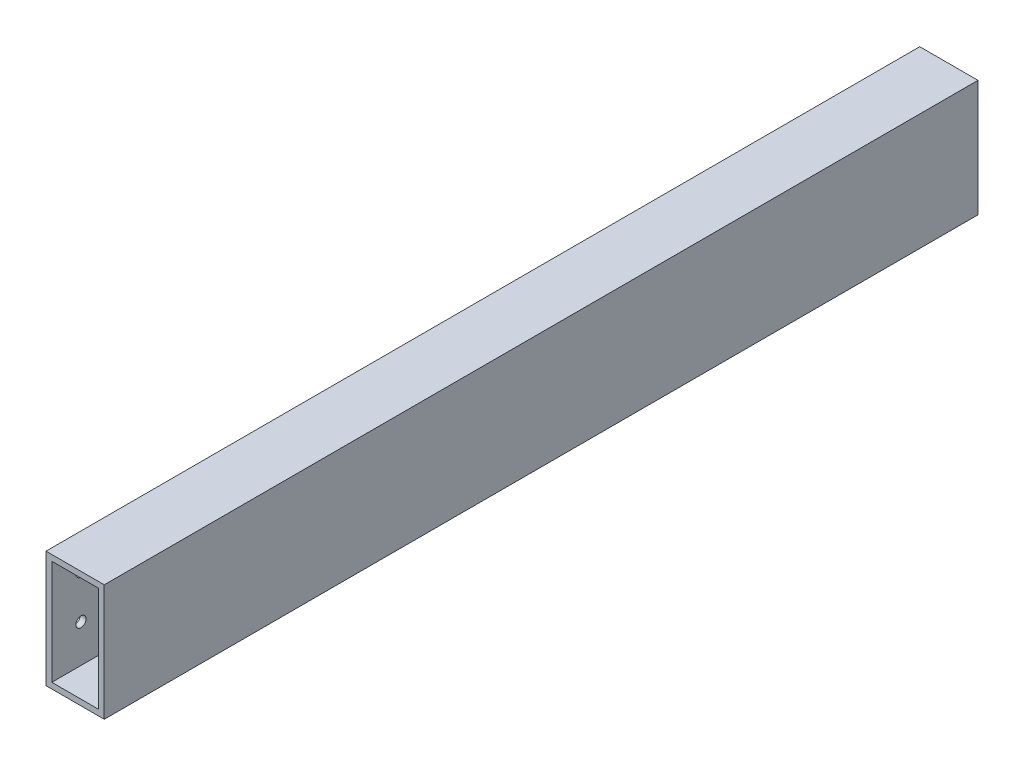
ISO-10303-21;
HEADER;
FILE_DESCRIPTION(('STEP AP214'),'2;1');
FILE_NAME('part.step','',(''),(''),'','','');
FILE_SCHEMA(('AUTOMOTIVE_DESIGN { 1 0 10303 214 1 1 1 1 }'));
ENDSEC;
DATA;
#1=APPLICATION_CONTEXT('core data for automotive mechanical design processes');
#2=APPLICATION_PROTOCOL_DEFINITION('international standard','automotive_design',2000,#1);
#3=PRODUCT_CONTEXT('',#1,'mechanical');
#4=PRODUCT('Part','Part','',(#3));
#5=PRODUCT_RELATED_PRODUCT_CATEGORY('part','',(#4));
#6=PRODUCT_DEFINITION_FORMATION('','',#4);
#7=PRODUCT_DEFINITION_CONTEXT('part definition',#1,'design');
#8=PRODUCT_DEFINITION('design','',#6,#7);
#9=PRODUCT_DEFINITION_SHAPE('','',#8);
#10=(LENGTH_UNIT() NAMED_UNIT(*) SI_UNIT(.MILLI.,.METRE.));
#11=(NAMED_UNIT(*) PLANE_ANGLE_UNIT() SI_UNIT($,.RADIAN.));
#12=(NAMED_UNIT(*) SI_UNIT($,.STERADIAN.) SOLID_ANGLE_UNIT());
#13=UNCERTAINTY_MEASURE_WITH_UNIT(LENGTH_MEASURE(1.E-05),#10,'distance_accuracy_value','');
#14=(GEOMETRIC_REPRESENTATION_CONTEXT(3) GLOBAL_UNCERTAINTY_ASSIGNED_CONTEXT((#13)) GLOBAL_UNIT_ASSIGNED_CONTEXT((#10,
#11,#12)) REPRESENTATION_CONTEXT('',''));
#15=CARTESIAN_POINT('',(0.,0.,0.));
#16=DIRECTION('',(0.,0.,1.));
#17=DIRECTION('',(1.,0.,0.));
#18=AXIS2_PLACEMENT_3D('',#15,#16,#17);
#19=CARTESIAN_POINT('',(0.,0.,300.));
#20=DIRECTION('',(0.,0.,-1.));
#21=DIRECTION('',(-1.,0.,0.));
#22=AXIS2_PLACEMENT_3D('',#19,#20,#21);
#23=PLANE('',#22);
#24=DIRECTION('',(0.,-1.,0.));
#25=VECTOR('',#24,1.);
#26=CARTESIAN_POINT('',(0.,0.,300.));
#27=LINE('',#26,#25);
#28=CARTESIAN_POINT('',(0.,40.,300.));
#29=VERTEX_POINT('',#28);
#30=CARTESIAN_POINT('',(0.,0.,300.));
#31=VERTEX_POINT('',#30);
#32=EDGE_CURVE('E136',#29,#31,#27,.T.);
#33=ORIENTED_EDGE('',*,*,#32,.T.);
#34=DIRECTION('',(1.,0.,0.));
#35=VECTOR('',#34,1.);
#36=CARTESIAN_POINT('',(0.,0.,300.));
#37=LINE('',#36,#35);
#38=CARTESIAN_POINT('',(20.,0.,300.));
#39=VERTEX_POINT('',#38);
#40=EDGE_CURVE('E139',#31,#39,#37,.T.);
#41=ORIENTED_EDGE('',*,*,#40,.T.);
#42=DIRECTION('',(0.,1.,0.));
#43=VECTOR('',#42,1.);
#44=CARTESIAN_POINT('',(20.,0.,300.));
#45=LINE('',#44,#43);
#46=CARTESIAN_POINT('',(20.,40.,300.));
#47=VERTEX_POINT('',#46);
#48=EDGE_CURVE('E142',#39,#47,#45,.T.);
#49=ORIENTED_EDGE('',*,*,#48,.T.);
#50=DIRECTION('',(-1.,0.,0.));
#51=VECTOR('',#50,1.);
#52=CARTESIAN_POINT('',(0.,40.,300.));
#53=LINE('',#52,#51);
#54=EDGE_CURVE('E144',#47,#29,#53,.T.);
#55=ORIENTED_EDGE('',*,*,#54,.T.);
#56=EDGE_LOOP('',(#33,#41,#49,#55));
#57=FACE_BOUND('',#56,.T.);
#58=DIRECTION('',(0.,-1.,0.));
#59=VECTOR('',#58,1.);
#60=CARTESIAN_POINT('',(2.,2.,300.));
#61=LINE('',#60,#59);
#62=CARTESIAN_POINT('',(2.,38.,300.));
#63=VERTEX_POINT('',#62);
#64=CARTESIAN_POINT('',(2.,2.,300.));
#65=VERTEX_POINT('',#64);
#66=EDGE_CURVE('E98',#63,#65,#61,.T.);
#67=ORIENTED_EDGE('',*,*,#66,.F.);
#68=DIRECTION('',(-1.,0.,0.));
#69=VECTOR('',#68,1.);
#70=CARTESIAN_POINT('',(2.,38.,300.));
#71=LINE('',#70,#69);
#72=CARTESIAN_POINT('',(18.,38.,300.));
#73=VERTEX_POINT('',#72);
#74=EDGE_CURVE('E120',#73,#63,#71,.T.);
#75=ORIENTED_EDGE('',*,*,#74,.F.);
#76=DIRECTION('',(0.,1.,0.));
#77=VECTOR('',#76,1.);
#78=CARTESIAN_POINT('',(18.,2.,300.));
#79=LINE('',#78,#77);
#80=CARTESIAN_POINT('',(18.,2.,300.));
#81=VERTEX_POINT('',#80);
#82=EDGE_CURVE('E118',#81,#73,#79,.T.);
#83=ORIENTED_EDGE('',*,*,#82,.F.);
#84=DIRECTION('',(1.,0.,0.));
#85=VECTOR('',#84,1.);
#86=CARTESIAN_POINT('',(2.,2.,300.));
#87=LINE('',#86,#85);
#88=EDGE_CURVE('E106',#65,#81,#87,.T.);
#89=ORIENTED_EDGE('',*,*,#88,.F.);
#90=EDGE_LOOP('',(#67,#75,#83,#89));
#91=FACE_BOUND('',#90,.T.);
#92=ADVANCED_FACE('F33',(#57,#91),#23,.F.);
#93=CARTESIAN_POINT('',(0.,0.,0.));
#94=DIRECTION('',(0.,0.,-1.));
#95=DIRECTION('',(-1.,0.,0.));
#96=AXIS2_PLACEMENT_3D('',#93,#94,#95);
#97=PLANE('',#96);
#98=DIRECTION('',(0.,-1.,0.));
#99=VECTOR('',#98,1.);
#100=CARTESIAN_POINT('',(0.,0.,0.));
#101=LINE('',#100,#99);
#102=CARTESIAN_POINT('',(0.,40.,0.));
#103=VERTEX_POINT('',#102);
#104=CARTESIAN_POINT('',(0.,0.,0.));
#105=VERTEX_POINT('',#104);
#106=EDGE_CURVE('E114',#103,#105,#101,.T.);
#107=ORIENTED_EDGE('',*,*,#106,.F.);
#108=DIRECTION('',(-1.,0.,0.));
#109=VECTOR('',#108,1.);
#110=CARTESIAN_POINT('',(0.,40.,0.));
#111=LINE('',#110,#109);
#112=CARTESIAN_POINT('',(20.,40.,0.));
#113=VERTEX_POINT('',#112);
#114=EDGE_CURVE('E140',#113,#103,#111,.T.);
#115=ORIENTED_EDGE('',*,*,#114,.F.);
#116=DIRECTION('',(0.,1.,0.));
#117=VECTOR('',#116,1.);
#118=CARTESIAN_POINT('',(20.,0.,0.));
#119=LINE('',#118,#117);
#120=CARTESIAN_POINT('',(20.,0.,0.));
#121=VERTEX_POINT('',#120);
#122=EDGE_CURVE('E151',#121,#113,#119,.T.);
#123=ORIENTED_EDGE('',*,*,#122,.F.);
#124=DIRECTION('',(1.,0.,0.));
#125=VECTOR('',#124,1.);
#126=CARTESIAN_POINT('',(0.,0.,0.));
#127=LINE('',#126,#125);
#128=EDGE_CURVE('E149',#105,#121,#127,.T.);
#129=ORIENTED_EDGE('',*,*,#128,.F.);
#130=EDGE_LOOP('',(#107,#115,#123,#129));
#131=FACE_BOUND('',#130,.T.);
#132=DIRECTION('',(-1.,0.,0.));
#133=VECTOR('',#132,1.);
#134=CARTESIAN_POINT('',(2.,38.,0.));
#135=LINE('',#134,#133);
#136=CARTESIAN_POINT('',(18.,38.,0.));
#137=VERTEX_POINT('',#136);
#138=CARTESIAN_POINT('',(2.,38.,0.));
#139=VERTEX_POINT('',#138);
#140=EDGE_CURVE('E107',#137,#139,#135,.T.);
#141=ORIENTED_EDGE('',*,*,#140,.T.);
#142=DIRECTION('',(0.,-1.,0.));
#143=VECTOR('',#142,1.);
#144=CARTESIAN_POINT('',(2.,2.,0.));
#145=LINE('',#144,#143);
#146=CARTESIAN_POINT('',(2.,2.,0.));
#147=VERTEX_POINT('',#146);
#148=EDGE_CURVE('E56',#139,#147,#145,.T.);
#149=ORIENTED_EDGE('',*,*,#148,.T.);
#150=DIRECTION('',(1.,0.,0.));
#151=VECTOR('',#150,1.);
#152=CARTESIAN_POINT('',(2.,2.,0.));
#153=LINE('',#152,#151);
#154=CARTESIAN_POINT('',(18.,2.,0.));
#155=VERTEX_POINT('',#154);
#156=EDGE_CURVE('E113',#147,#155,#153,.T.);
#157=ORIENTED_EDGE('',*,*,#156,.T.);
#158=DIRECTION('',(0.,1.,0.));
#159=VECTOR('',#158,1.);
#160=CARTESIAN_POINT('',(18.,2.,0.));
#161=LINE('',#160,#159);
#162=EDGE_CURVE('E128',#155,#137,#161,.T.);
#163=ORIENTED_EDGE('',*,*,#162,.T.);
#164=EDGE_LOOP('',(#141,#149,#157,#163));
#165=FACE_BOUND('',#164,.T.);
#166=ADVANCED_FACE('F169',(#131,#165),#97,.T.);
#167=CARTESIAN_POINT('',(0.,0.,300.));
#168=DIRECTION('',(1.,0.,0.));
#169=DIRECTION('',(0.,0.,-1.));
#170=AXIS2_PLACEMENT_3D('',#167,#168,#169);
#171=PLANE('',#170);
#172=CARTESIAN_POINT('',(0.,30.,290.));
#173=DIRECTION('',(-1.,0.,0.));
#174=DIRECTION('',(0.,0.,-1.));
#175=AXIS2_PLACEMENT_3D('',#172,#173,#174);
#176=CIRCLE('',#175,1.74999999999998);
#177=CARTESIAN_POINT('',(0.,30.,288.25));
#178=VERTEX_POINT('',#177);
#179=EDGE_CURVE('E240',#178,#178,#176,.T.);
#180=ORIENTED_EDGE('',*,*,#179,.F.);
#181=EDGE_LOOP('',(#180));
#182=FACE_BOUND('',#181,.T.);
#183=CARTESIAN_POINT('',(0.,15.,290.));
#184=DIRECTION('',(-1.,0.,0.));
#185=DIRECTION('',(0.,0.,-1.));
#186=AXIS2_PLACEMENT_3D('',#183,#184,#185);
#187=CIRCLE('',#186,1.74999999999998);
#188=CARTESIAN_POINT('',(0.,15.,288.25));
#189=VERTEX_POINT('',#188);
#190=EDGE_CURVE('E244',#189,#189,#187,.T.);
#191=ORIENTED_EDGE('',*,*,#190,.F.);
#192=EDGE_LOOP('',(#191));
#193=FACE_BOUND('',#192,.T.);
#194=CARTESIAN_POINT('',(0.,15.,245.));
#195=DIRECTION('',(-1.,0.,0.));
#196=DIRECTION('',(0.,0.,-1.));
#197=AXIS2_PLACEMENT_3D('',#194,#195,#196);
#198=CIRCLE('',#197,1.74999999999998);
#199=CARTESIAN_POINT('',(0.,15.,243.25));
#200=VERTEX_POINT('',#199);
#201=EDGE_CURVE('E248',#200,#200,#198,.T.);
#202=ORIENTED_EDGE('',*,*,#201,.F.);
#203=EDGE_LOOP('',(#202));
#204=FACE_BOUND('',#203,.T.);
#205=CARTESIAN_POINT('',(0.,15.,10.));
#206=DIRECTION('',(-1.,0.,0.));
#207=DIRECTION('',(0.,0.,1.));
#208=AXIS2_PLACEMENT_3D('',#205,#206,#207);
#209=CIRCLE('',#208,1.75);
#210=CARTESIAN_POINT('',(0.,15.,11.75));
#211=VERTEX_POINT('',#210);
#212=EDGE_CURVE('E257',#211,#211,#209,.T.);
#213=ORIENTED_EDGE('',*,*,#212,.F.);
#214=EDGE_LOOP('',(#213));
#215=FACE_BOUND('',#214,.T.);
#216=CARTESIAN_POINT('',(0.,15.,70.));
#217=DIRECTION('',(-1.,0.,0.));
#218=DIRECTION('',(0.,0.,1.));
#219=AXIS2_PLACEMENT_3D('',#216,#217,#218);
#220=CIRCLE('',#219,1.75);
#221=CARTESIAN_POINT('',(0.,15.,71.75));
#222=VERTEX_POINT('',#221);
#223=EDGE_CURVE('E253',#222,#222,#220,.T.);
#224=ORIENTED_EDGE('',*,*,#223,.F.);
#225=EDGE_LOOP('',(#224));
#226=FACE_BOUND('',#225,.T.);
#227=CARTESIAN_POINT('',(0.,15.,55.));
#228=DIRECTION('',(-1.,0.,0.));
#229=DIRECTION('',(0.,0.,1.));
#230=AXIS2_PLACEMENT_3D('',#227,#228,#229);
#231=CIRCLE('',#230,1.75);
#232=CARTESIAN_POINT('',(0.,15.,56.75));
#233=VERTEX_POINT('',#232);
#234=EDGE_CURVE('E264',#233,#233,#231,.T.);
#235=ORIENTED_EDGE('',*,*,#234,.F.);
#236=EDGE_LOOP('',(#235));
#237=FACE_BOUND('',#236,.T.);
#238=CARTESIAN_POINT('',(0.,15.,230.));
#239=DIRECTION('',(-1.,0.,0.));
#240=DIRECTION('',(0.,0.,-1.));
#241=AXIS2_PLACEMENT_3D('',#238,#239,#240);
#242=CIRCLE('',#241,1.74999999999998);
#243=CARTESIAN_POINT('',(0.,15.,228.25));
#244=VERTEX_POINT('',#243);
#245=EDGE_CURVE('E252',#244,#244,#242,.T.);
#246=ORIENTED_EDGE('',*,*,#245,.F.);
#247=EDGE_LOOP('',(#246));
#248=FACE_BOUND('',#247,.T.);
#249=CARTESIAN_POINT('',(0.,30.,10.));
#250=DIRECTION('',(-1.,0.,0.));
#251=DIRECTION('',(0.,0.,1.));
#252=AXIS2_PLACEMENT_3D('',#249,#250,#251);
#253=CIRCLE('',#252,1.75);
#254=CARTESIAN_POINT('',(0.,30.,11.75));
#255=VERTEX_POINT('',#254);
#256=EDGE_CURVE('E236',#255,#255,#253,.T.);
#257=ORIENTED_EDGE('',*,*,#256,.F.);
#258=EDGE_LOOP('',(#257));
#259=FACE_BOUND('',#258,.T.);
#260=ORIENTED_EDGE('',*,*,#106,.T.);
#261=DIRECTION('',(0.,0.,-1.));
#262=VECTOR('',#261,1.);
#263=CARTESIAN_POINT('',(0.,0.,300.));
#264=LINE('',#263,#262);
#265=EDGE_CURVE('E11',#31,#105,#264,.T.);
#266=ORIENTED_EDGE('',*,*,#265,.F.);
#267=ORIENTED_EDGE('',*,*,#32,.F.);
#268=DIRECTION('',(0.,0.,-1.));
#269=VECTOR('',#268,1.);
#270=CARTESIAN_POINT('',(0.,40.,300.));
#271=LINE('',#270,#269);
#272=EDGE_CURVE('E146',#29,#103,#271,.T.);
#273=ORIENTED_EDGE('',*,*,#272,.T.);
#274=EDGE_LOOP('',(#260,#266,#267,#273));
#275=FACE_BOUND('',#274,.T.);
#276=ADVANCED_FACE('F35',(#182,#193,#204,#215,#226,#237,#248,#259,#275),#171,.F.);
#277=CARTESIAN_POINT('',(0.,0.,300.));
#278=DIRECTION('',(0.,1.,0.));
#279=DIRECTION('',(0.,0.,1.));
#280=AXIS2_PLACEMENT_3D('',#277,#278,#279);
#281=PLANE('',#280);
#282=ORIENTED_EDGE('',*,*,#128,.T.);
#283=DIRECTION('',(0.,0.,-1.));
#284=VECTOR('',#283,1.);
#285=CARTESIAN_POINT('',(20.,0.,300.));
#286=LINE('',#285,#284);
#287=EDGE_CURVE('E41',#39,#121,#286,.T.);
#288=ORIENTED_EDGE('',*,*,#287,.F.);
#289=ORIENTED_EDGE('',*,*,#40,.F.);
#290=ORIENTED_EDGE('',*,*,#265,.T.);
#291=EDGE_LOOP('',(#282,#288,#289,#290));
#292=FACE_BOUND('',#291,.T.);
#293=ADVANCED_FACE('F179',(#292),#281,.F.);
#294=CARTESIAN_POINT('',(20.,0.,300.));
#295=DIRECTION('',(-1.,0.,0.));
#296=DIRECTION('',(0.,0.,1.));
#297=AXIS2_PLACEMENT_3D('',#294,#295,#296);
#298=PLANE('',#297);
#299=ORIENTED_EDGE('',*,*,#122,.T.);
#300=DIRECTION('',(0.,0.,-1.));
#301=VECTOR('',#300,1.);
#302=CARTESIAN_POINT('',(20.,40.,300.));
#303=LINE('',#302,#301);
#304=EDGE_CURVE('E156',#47,#113,#303,.T.);
#305=ORIENTED_EDGE('',*,*,#304,.F.);
#306=ORIENTED_EDGE('',*,*,#48,.F.);
#307=ORIENTED_EDGE('',*,*,#287,.T.);
#308=EDGE_LOOP('',(#299,#305,#306,#307));
#309=FACE_BOUND('',#308,.T.);
#310=ADVANCED_FACE('F163',(#309),#298,.F.);
#311=CARTESIAN_POINT('',(0.,40.,300.));
#312=DIRECTION('',(0.,-1.,0.));
#313=DIRECTION('',(0.,0.,-1.));
#314=AXIS2_PLACEMENT_3D('',#311,#312,#313);
#315=PLANE('',#314);
#316=ORIENTED_EDGE('',*,*,#114,.T.);
#317=ORIENTED_EDGE('',*,*,#272,.F.);
#318=ORIENTED_EDGE('',*,*,#54,.F.);
#319=ORIENTED_EDGE('',*,*,#304,.T.);
#320=EDGE_LOOP('',(#316,#317,#318,#319));
#321=FACE_BOUND('',#320,.T.);
#322=ADVANCED_FACE('F173',(#321),#315,.F.);
#323=CARTESIAN_POINT('',(2.,2.,300.));
#324=DIRECTION('',(1.,0.,0.));
#325=DIRECTION('',(0.,0.,-1.));
#326=AXIS2_PLACEMENT_3D('',#323,#324,#325);
#327=PLANE('',#326);
#328=CARTESIAN_POINT('',(2.,30.,290.));
#329=DIRECTION('',(-1.,0.,0.));
#330=DIRECTION('',(0.,0.,-1.));
#331=AXIS2_PLACEMENT_3D('',#328,#329,#330);
#332=CIRCLE('',#331,1.74999999999998);
#333=CARTESIAN_POINT('',(2.,30.,288.25));
#334=VERTEX_POINT('',#333);
#335=EDGE_CURVE('E208',#334,#334,#332,.T.);
#336=ORIENTED_EDGE('',*,*,#335,.T.);
#337=EDGE_LOOP('',(#336));
#338=FACE_BOUND('',#337,.T.);
#339=CARTESIAN_POINT('',(2.,15.,290.));
#340=DIRECTION('',(-1.,0.,0.));
#341=DIRECTION('',(0.,0.,-1.));
#342=AXIS2_PLACEMENT_3D('',#339,#340,#341);
#343=CIRCLE('',#342,1.74999999999998);
#344=CARTESIAN_POINT('',(2.,15.,288.25));
#345=VERTEX_POINT('',#344);
#346=EDGE_CURVE('E212',#345,#345,#343,.T.);
#347=ORIENTED_EDGE('',*,*,#346,.T.);
#348=EDGE_LOOP('',(#347));
#349=FACE_BOUND('',#348,.T.);
#350=CARTESIAN_POINT('',(2.,15.,245.));
#351=DIRECTION('',(-1.,0.,0.));
#352=DIRECTION('',(0.,0.,-1.));
#353=AXIS2_PLACEMENT_3D('',#350,#351,#352);
#354=CIRCLE('',#353,1.74999999999998);
#355=CARTESIAN_POINT('',(2.,15.,243.25));
#356=VERTEX_POINT('',#355);
#357=EDGE_CURVE('E216',#356,#356,#354,.T.);
#358=ORIENTED_EDGE('',*,*,#357,.T.);
#359=EDGE_LOOP('',(#358));
#360=FACE_BOUND('',#359,.T.);
#361=CARTESIAN_POINT('',(2.,15.,10.));
#362=DIRECTION('',(-1.,0.,0.));
#363=DIRECTION('',(0.,0.,1.));
#364=AXIS2_PLACEMENT_3D('',#361,#362,#363);
#365=CIRCLE('',#364,1.75);
#366=CARTESIAN_POINT('',(2.,15.,11.75));
#367=VERTEX_POINT('',#366);
#368=EDGE_CURVE('E220',#367,#367,#365,.T.);
#369=ORIENTED_EDGE('',*,*,#368,.T.);
#370=EDGE_LOOP('',(#369));
#371=FACE_BOUND('',#370,.T.);
#372=CARTESIAN_POINT('',(2.,15.,70.));
#373=DIRECTION('',(-1.,0.,0.));
#374=DIRECTION('',(0.,0.,1.));
#375=AXIS2_PLACEMENT_3D('',#372,#373,#374);
#376=CIRCLE('',#375,1.75);
#377=CARTESIAN_POINT('',(2.,15.,71.75));
#378=VERTEX_POINT('',#377);
#379=EDGE_CURVE('E224',#378,#378,#376,.T.);
#380=ORIENTED_EDGE('',*,*,#379,.T.);
#381=EDGE_LOOP('',(#380));
#382=FACE_BOUND('',#381,.T.);
#383=CARTESIAN_POINT('',(2.,15.,55.));
#384=DIRECTION('',(-1.,0.,0.));
#385=DIRECTION('',(0.,0.,1.));
#386=AXIS2_PLACEMENT_3D('',#383,#384,#385);
#387=CIRCLE('',#386,1.75);
#388=CARTESIAN_POINT('',(2.,15.,56.75));
#389=VERTEX_POINT('',#388);
#390=EDGE_CURVE('E228',#389,#389,#387,.T.);
#391=ORIENTED_EDGE('',*,*,#390,.T.);
#392=EDGE_LOOP('',(#391));
#393=FACE_BOUND('',#392,.T.);
#394=CARTESIAN_POINT('',(2.,15.,230.));
#395=DIRECTION('',(-1.,0.,0.));
#396=DIRECTION('',(0.,0.,-1.));
#397=AXIS2_PLACEMENT_3D('',#394,#395,#396);
#398=CIRCLE('',#397,1.74999999999998);
#399=CARTESIAN_POINT('',(2.,15.,228.25));
#400=VERTEX_POINT('',#399);
#401=EDGE_CURVE('E232',#400,#400,#398,.T.);
#402=ORIENTED_EDGE('',*,*,#401,.T.);
#403=EDGE_LOOP('',(#402));
#404=FACE_BOUND('',#403,.T.);
#405=CARTESIAN_POINT('',(2.,30.,10.));
#406=DIRECTION('',(-1.,0.,0.));
#407=DIRECTION('',(0.,0.,1.));
#408=AXIS2_PLACEMENT_3D('',#405,#406,#407);
#409=CIRCLE('',#408,1.75);
#410=CARTESIAN_POINT('',(2.,30.,11.75));
#411=VERTEX_POINT('',#410);
#412=EDGE_CURVE('E126',#411,#411,#409,.T.);
#413=ORIENTED_EDGE('',*,*,#412,.T.);
#414=EDGE_LOOP('',(#413));
#415=FACE_BOUND('',#414,.T.);
#416=ORIENTED_EDGE('',*,*,#148,.F.);
#417=DIRECTION('',(0.,0.,-1.));
#418=VECTOR('',#417,1.);
#419=CARTESIAN_POINT('',(2.,38.,300.));
#420=LINE('',#419,#418);
#421=EDGE_CURVE('E102',#63,#139,#420,.T.);
#422=ORIENTED_EDGE('',*,*,#421,.F.);
#423=ORIENTED_EDGE('',*,*,#66,.T.);
#424=DIRECTION('',(0.,0.,-1.));
#425=VECTOR('',#424,1.);
#426=CARTESIAN_POINT('',(2.,2.,300.));
#427=LINE('',#426,#425);
#428=EDGE_CURVE('E101',#65,#147,#427,.T.);
#429=ORIENTED_EDGE('',*,*,#428,.T.);
#430=EDGE_LOOP('',(#416,#422,#423,#429));
#431=FACE_BOUND('',#430,.T.);
#432=ADVANCED_FACE('F100',(#338,#349,#360,#371,#382,#393,#404,#415,#431),#327,.T.);
#433=CARTESIAN_POINT('',(2.,2.,300.));
#434=DIRECTION('',(0.,1.,0.));
#435=DIRECTION('',(0.,0.,1.));
#436=AXIS2_PLACEMENT_3D('',#433,#434,#435);
#437=PLANE('',#436);
#438=ORIENTED_EDGE('',*,*,#156,.F.);
#439=ORIENTED_EDGE('',*,*,#428,.F.);
#440=ORIENTED_EDGE('',*,*,#88,.T.);
#441=DIRECTION('',(0.,0.,-1.));
#442=VECTOR('',#441,1.);
#443=CARTESIAN_POINT('',(18.,2.,300.));
#444=LINE('',#443,#442);
#445=EDGE_CURVE('E115',#81,#155,#444,.T.);
#446=ORIENTED_EDGE('',*,*,#445,.T.);
#447=EDGE_LOOP('',(#438,#439,#440,#446));
#448=FACE_BOUND('',#447,.T.);
#449=ADVANCED_FACE('F110',(#448),#437,.T.);
#450=CARTESIAN_POINT('',(18.,2.,300.));
#451=DIRECTION('',(-1.,0.,0.));
#452=DIRECTION('',(0.,0.,1.));
#453=AXIS2_PLACEMENT_3D('',#450,#451,#452);
#454=PLANE('',#453);
#455=ORIENTED_EDGE('',*,*,#162,.F.);
#456=ORIENTED_EDGE('',*,*,#445,.F.);
#457=ORIENTED_EDGE('',*,*,#82,.T.);
#458=DIRECTION('',(0.,0.,-1.));
#459=VECTOR('',#458,1.);
#460=CARTESIAN_POINT('',(18.,38.,300.));
#461=LINE('',#460,#459);
#462=EDGE_CURVE('E48',#73,#137,#461,.T.);
#463=ORIENTED_EDGE('',*,*,#462,.T.);
#464=EDGE_LOOP('',(#455,#456,#457,#463));
#465=FACE_BOUND('',#464,.T.);
#466=ADVANCED_FACE('F204',(#465),#454,.T.);
#467=CARTESIAN_POINT('',(2.,38.,300.));
#468=DIRECTION('',(0.,-1.,0.));
#469=DIRECTION('',(0.,0.,-1.));
#470=AXIS2_PLACEMENT_3D('',#467,#468,#469);
#471=PLANE('',#470);
#472=ORIENTED_EDGE('',*,*,#140,.F.);
#473=ORIENTED_EDGE('',*,*,#462,.F.);
#474=ORIENTED_EDGE('',*,*,#74,.T.);
#475=ORIENTED_EDGE('',*,*,#421,.T.);
#476=EDGE_LOOP('',(#472,#473,#474,#475));
#477=FACE_BOUND('',#476,.T.);
#478=ADVANCED_FACE('F279',(#477),#471,.T.);
#479=CARTESIAN_POINT('',(2.,30.,10.));
#480=DIRECTION('',(-1.,0.,0.));
#481=DIRECTION('',(0.,0.,1.));
#482=AXIS2_PLACEMENT_3D('',#479,#480,#481);
#483=CYLINDRICAL_SURFACE('',#482,1.75);
#484=ORIENTED_EDGE('',*,*,#412,.F.);
#485=EDGE_LOOP('',(#484));
#486=FACE_BOUND('',#485,.T.);
#487=ORIENTED_EDGE('',*,*,#256,.T.);
#488=EDGE_LOOP('',(#487));
#489=FACE_BOUND('',#488,.T.);
#490=ADVANCED_FACE('F276',(#486,#489),#483,.F.);
#491=CARTESIAN_POINT('',(2.,15.,230.));
#492=DIRECTION('',(-1.,0.,0.));
#493=DIRECTION('',(0.,0.,1.));
#494=AXIS2_PLACEMENT_3D('',#491,#492,#493);
#495=CYLINDRICAL_SURFACE('',#494,1.74999999999998);
#496=ORIENTED_EDGE('',*,*,#401,.F.);
#497=EDGE_LOOP('',(#496));
#498=FACE_BOUND('',#497,.T.);
#499=ORIENTED_EDGE('',*,*,#245,.T.);
#500=EDGE_LOOP('',(#499));
#501=FACE_BOUND('',#500,.T.);
#502=ADVANCED_FACE('F278',(#498,#501),#495,.F.);
#503=CARTESIAN_POINT('',(2.,15.,55.));
#504=DIRECTION('',(-1.,0.,0.));
#505=DIRECTION('',(0.,0.,1.));
#506=AXIS2_PLACEMENT_3D('',#503,#504,#505);
#507=CYLINDRICAL_SURFACE('',#506,1.75);
#508=ORIENTED_EDGE('',*,*,#390,.F.);
#509=EDGE_LOOP('',(#508));
#510=FACE_BOUND('',#509,.T.);
#511=ORIENTED_EDGE('',*,*,#234,.T.);
#512=EDGE_LOOP('',(#511));
#513=FACE_BOUND('',#512,.T.);
#514=ADVANCED_FACE('F269',(#510,#513),#507,.F.);
#515=CARTESIAN_POINT('',(2.,15.,70.));
#516=DIRECTION('',(-1.,0.,0.));
#517=DIRECTION('',(0.,0.,1.));
#518=AXIS2_PLACEMENT_3D('',#515,#516,#517);
#519=CYLINDRICAL_SURFACE('',#518,1.75);
#520=ORIENTED_EDGE('',*,*,#379,.F.);
#521=EDGE_LOOP('',(#520));
#522=FACE_BOUND('',#521,.T.);
#523=ORIENTED_EDGE('',*,*,#223,.T.);
#524=EDGE_LOOP('',(#523));
#525=FACE_BOUND('',#524,.T.);
#526=ADVANCED_FACE('F336',(#522,#525),#519,.F.);
#527=CARTESIAN_POINT('',(2.,15.,10.));
#528=DIRECTION('',(-1.,0.,0.));
#529=DIRECTION('',(0.,0.,1.));
#530=AXIS2_PLACEMENT_3D('',#527,#528,#529);
#531=CYLINDRICAL_SURFACE('',#530,1.75);
#532=ORIENTED_EDGE('',*,*,#368,.F.);
#533=EDGE_LOOP('',(#532));
#534=FACE_BOUND('',#533,.T.);
#535=ORIENTED_EDGE('',*,*,#212,.T.);
#536=EDGE_LOOP('',(#535));
#537=FACE_BOUND('',#536,.T.);
#538=ADVANCED_FACE('F346',(#534,#537),#531,.F.);
#539=CARTESIAN_POINT('',(2.,15.,245.));
#540=DIRECTION('',(-1.,0.,0.));
#541=DIRECTION('',(0.,0.,1.));
#542=AXIS2_PLACEMENT_3D('',#539,#540,#541);
#543=CYLINDRICAL_SURFACE('',#542,1.74999999999998);
#544=ORIENTED_EDGE('',*,*,#357,.F.);
#545=EDGE_LOOP('',(#544));
#546=FACE_BOUND('',#545,.T.);
#547=ORIENTED_EDGE('',*,*,#201,.T.);
#548=EDGE_LOOP('',(#547));
#549=FACE_BOUND('',#548,.T.);
#550=ADVANCED_FACE('F356',(#546,#549),#543,.F.);
#551=CARTESIAN_POINT('',(2.,15.,290.));
#552=DIRECTION('',(-1.,0.,0.));
#553=DIRECTION('',(0.,0.,1.));
#554=AXIS2_PLACEMENT_3D('',#551,#552,#553);
#555=CYLINDRICAL_SURFACE('',#554,1.74999999999998);
#556=ORIENTED_EDGE('',*,*,#346,.F.);
#557=EDGE_LOOP('',(#556));
#558=FACE_BOUND('',#557,.T.);
#559=ORIENTED_EDGE('',*,*,#190,.T.);
#560=EDGE_LOOP('',(#559));
#561=FACE_BOUND('',#560,.T.);
#562=ADVANCED_FACE('F366',(#558,#561),#555,.F.);
#563=CARTESIAN_POINT('',(2.,30.,290.));
#564=DIRECTION('',(-1.,0.,0.));
#565=DIRECTION('',(0.,0.,1.));
#566=AXIS2_PLACEMENT_3D('',#563,#564,#565);
#567=CYLINDRICAL_SURFACE('',#566,1.74999999999998);
#568=ORIENTED_EDGE('',*,*,#335,.F.);
#569=EDGE_LOOP('',(#568));
#570=FACE_BOUND('',#569,.T.);
#571=ORIENTED_EDGE('',*,*,#179,.T.);
#572=EDGE_LOOP('',(#571));
#573=FACE_BOUND('',#572,.T.);
#574=ADVANCED_FACE('F289',(#570,#573),#567,.F.);
#575=CLOSED_SHELL('',(#92,#166,#276,#293,#310,#322,#432,#449,#466,#478,#490,#502,#514,#526,#538,
#550,#562,#574));
#576=MANIFOLD_SOLID_BREP('B2',#575);
#577=ADVANCED_BREP_SHAPE_REPRESENTATION('',(#18,#576),#14);
#578=SHAPE_DEFINITION_REPRESENTATION(#9,#577);
ENDSEC;
END-ISO-10303-21;
